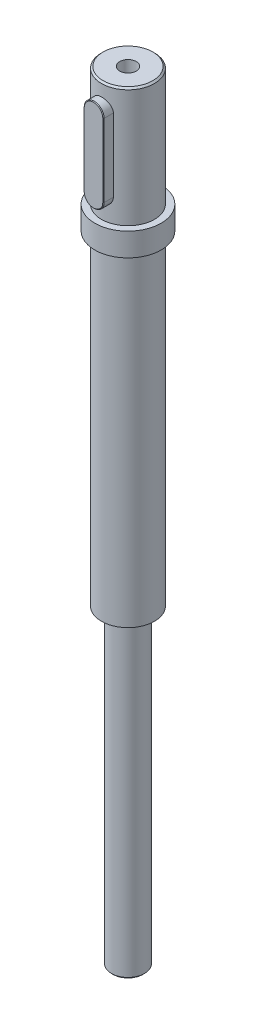
ISO-10303-21;
HEADER;
FILE_DESCRIPTION(('STEP AP214'),'2;1');
FILE_NAME('part.step','',(''),(''),'','','');
FILE_SCHEMA(('AUTOMOTIVE_DESIGN { 1 0 10303 214 1 1 1 1 }'));
ENDSEC;
DATA;
#1=APPLICATION_CONTEXT('core data for automotive mechanical design processes');
#2=APPLICATION_PROTOCOL_DEFINITION('international standard','automotive_design',2000,#1);
#3=PRODUCT_CONTEXT('',#1,'mechanical');
#4=PRODUCT('Part','Part','',(#3));
#5=PRODUCT_RELATED_PRODUCT_CATEGORY('part','',(#4));
#6=PRODUCT_DEFINITION_FORMATION('','',#4);
#7=PRODUCT_DEFINITION_CONTEXT('part definition',#1,'design');
#8=PRODUCT_DEFINITION('design','',#6,#7);
#9=PRODUCT_DEFINITION_SHAPE('','',#8);
#10=(LENGTH_UNIT() NAMED_UNIT(*) SI_UNIT(.MILLI.,.METRE.));
#11=(NAMED_UNIT(*) PLANE_ANGLE_UNIT() SI_UNIT($,.RADIAN.));
#12=(NAMED_UNIT(*) SI_UNIT($,.STERADIAN.) SOLID_ANGLE_UNIT());
#13=UNCERTAINTY_MEASURE_WITH_UNIT(LENGTH_MEASURE(1.E-05),#10,'distance_accuracy_value','');
#14=(GEOMETRIC_REPRESENTATION_CONTEXT(3) GLOBAL_UNCERTAINTY_ASSIGNED_CONTEXT((#13)) GLOBAL_UNIT_ASSIGNED_CONTEXT((#10,
#11,#12)) REPRESENTATION_CONTEXT('',''));
#15=CARTESIAN_POINT('',(0.,0.,0.));
#16=DIRECTION('',(0.,0.,1.));
#17=DIRECTION('',(1.,0.,0.));
#18=AXIS2_PLACEMENT_3D('',#15,#16,#17);
#19=CARTESIAN_POINT('',(0.,117.5,0.));
#20=DIRECTION('',(0.,-1.,0.));
#21=DIRECTION('',(0.,0.,-1.));
#22=AXIS2_PLACEMENT_3D('',#19,#20,#21);
#23=CYLINDRICAL_SURFACE('',#22,4.);
#24=CARTESIAN_POINT('',(0.,117.25,0.));
#25=DIRECTION('',(0.,1.,0.));
#26=DIRECTION('',(0.,0.,1.));
#27=AXIS2_PLACEMENT_3D('',#24,#25,#26);
#28=CIRCLE('',#27,4.);
#29=CARTESIAN_POINT('',(0.,117.25,4.));
#30=VERTEX_POINT('',#29);
#31=EDGE_CURVE('E161',#30,#30,#28,.F.);
#32=ORIENTED_EDGE('',*,*,#31,.T.);
#33=EDGE_LOOP('',(#32));
#34=FACE_BOUND('',#33,.T.);
#35=CARTESIAN_POINT('',(0.,99.5,0.));
#36=DIRECTION('',(0.,1.,0.));
#37=DIRECTION('',(0.,0.,1.));
#38=AXIS2_PLACEMENT_3D('',#35,#36,#37);
#39=CIRCLE('',#38,4.);
#40=CARTESIAN_POINT('',(0.,99.5,4.));
#41=VERTEX_POINT('',#40);
#42=EDGE_CURVE('E117',#41,#41,#39,.T.);
#43=ORIENTED_EDGE('',*,*,#42,.T.);
#44=EDGE_LOOP('',(#43));
#45=FACE_BOUND('',#44,.T.);
#46=CARTESIAN_POINT('',(-1.5,103.,3.70809924354783));
#47=CARTESIAN_POINT('',(-1.50000304106109,102.918992516279,3.70809640633806));
#48=CARTESIAN_POINT('',(-1.49341597549487,102.838005077496,3.71078260240986));
#49=CARTESIAN_POINT('',(-1.46736187895468,102.678471917087,3.72116159304967));
#50=CARTESIAN_POINT('',(-1.44789523373263,102.599926122405,3.72885423767112));
#51=CARTESIAN_POINT('',(-1.39689657610574,102.447624628386,3.748254802809));
#52=CARTESIAN_POINT('',(-1.36539347266348,102.373857943349,3.7599530956926));
#53=CARTESIAN_POINT('',(-1.29131856742698,102.232628103181,3.78603134206598));
#54=CARTESIAN_POINT('',(-1.24874344095039,102.165166849718,3.80041210067323));
#55=CARTESIAN_POINT('',(-1.15146661374163,102.035109688377,3.83103574665712));
#56=CARTESIAN_POINT('',(-1.09630381213307,101.972871470371,3.84733341923603));
#57=CARTESIAN_POINT('',(-0.976395839778934,101.858277185329,3.87949750628547));
#58=CARTESIAN_POINT('',(-0.911648630256685,101.805923226258,3.89536382814785));
#59=CARTESIAN_POINT('',(-0.771694655177602,101.710860487704,3.92552873936553));
#60=CARTESIAN_POINT('',(-0.696206947538028,101.668540525284,3.93975561223505));
#61=CARTESIAN_POINT('',(-0.538555771965246,101.597348827475,3.96438007973847));
#62=CARTESIAN_POINT('',(-0.456394630933535,101.568472428008,3.97477900217006));
#63=CARTESIAN_POINT('',(-0.291489341676831,101.526242104225,3.9901869710344));
#64=CARTESIAN_POINT('',(-0.208923197281596,101.51227237256,3.99540915214774));
#65=CARTESIAN_POINT('',(-0.0424643637947871,101.498278799055,4.0006401410794));
#66=CARTESIAN_POINT('',(0.041427885062831,101.498250422381,4.00065064414902));
#67=CARTESIAN_POINT('',(0.203743543064475,101.511781761465,3.99559265903894));
#68=CARTESIAN_POINT('',(0.2822321782669,101.524669297949,3.99077541996683));
#69=CARTESIAN_POINT('',(0.435839217984393,101.562535915226,3.97693274932263));
#70=CARTESIAN_POINT('',(0.510957383430299,101.587515852262,3.96790701975578));
#71=CARTESIAN_POINT('',(0.656989017303104,101.649170451676,3.94637769167531));
#72=CARTESIAN_POINT('',(0.727825392287309,101.686010005268,3.93382539470077));
#73=CARTESIAN_POINT('',(0.862486607957559,101.770192096929,3.90651310225279));
#74=CARTESIAN_POINT('',(0.926309176932322,101.817538023018,3.8917523951284));
#75=CARTESIAN_POINT('',(1.04909048680093,101.924627286283,3.86052529655816));
#76=CARTESIAN_POINT('',(1.10754614526348,101.98493391565,3.84400963763883));
#77=CARTESIAN_POINT('',(1.21370395569343,102.114592993322,3.81182460645722));
#78=CARTESIAN_POINT('',(1.261403406929,102.183947706587,3.79615544748847));
#79=CARTESIAN_POINT('',(1.34565611808151,102.331719467463,3.76712703500335));
#80=CARTESIAN_POINT('',(1.3819384785183,102.410303493686,3.75382677150277));
#81=CARTESIAN_POINT('',(1.44056464441501,102.573096225168,3.73172438629003));
#82=CARTESIAN_POINT('',(1.46291620605595,102.657301771594,3.72291976205783));
#83=CARTESIAN_POINT('',(1.49190191709668,102.823975962316,3.71139597222848));
#84=CARTESIAN_POINT('',(1.49933521158966,102.906284105536,3.70836785241537));
#85=CARTESIAN_POINT('',(1.50057885636272,103.071009356742,3.70786539525016));
#86=CARTESIAN_POINT('',(1.49439261093762,103.153426432352,3.71038967003987));
#87=CARTESIAN_POINT('',(1.46929733520157,103.311929922288,3.72039381629735));
#88=CARTESIAN_POINT('',(1.45100618334225,103.388131135765,3.72763276216449));
#89=CARTESIAN_POINT('',(1.40299774640638,103.53634794472,3.74596487046362));
#90=CARTESIAN_POINT('',(1.37327812034623,103.608362679168,3.75705882250173));
#91=CARTESIAN_POINT('',(1.30200292275278,103.749164438076,3.7823624311608));
#92=CARTESIAN_POINT('',(1.26004545177046,103.817729292137,3.79667328892065));
#93=CARTESIAN_POINT('',(1.16591317862479,103.947128981726,3.82662814294291));
#94=CARTESIAN_POINT('',(1.11373463696435,104.007960974625,3.84227262594077));
#95=CARTESIAN_POINT('',(0.996727340900941,104.124168373195,3.87433046553184));
#96=CARTESIAN_POINT('',(0.931306341491062,104.178953408769,3.89072969357028));
#97=CARTESIAN_POINT('',(0.791797471753148,104.276838367589,3.92149874963302));
#98=CARTESIAN_POINT('',(0.717709573322671,104.319938252946,3.93586857107664));
#99=CARTESIAN_POINT('',(0.563016329468475,104.3929460562,3.96094985704552));
#100=CARTESIAN_POINT('',(0.482434433064626,104.422899123793,3.9716738133801));
#101=CARTESIAN_POINT('',(0.316881887523253,104.46865641385,3.98829436712571));
#102=CARTESIAN_POINT('',(0.23191332072359,104.484467285422,3.99419323299413));
#103=CARTESIAN_POINT('',(0.0653355852738132,104.500774402755,4.00028407317073));
#104=CARTESIAN_POINT('',(-0.0161807680608467,104.502109483059,4.00078860953764));
#105=CARTESIAN_POINT('',(-0.178226786412424,104.491584840555,3.99684889809223));
#106=CARTESIAN_POINT('',(-0.258756569245257,104.479726709114,3.9924052471313));
#107=CARTESIAN_POINT('',(-0.414548248377124,104.443741148506,3.97921089603771));
#108=CARTESIAN_POINT('',(-0.489890731068831,104.419920094122,3.97056791378017));
#109=CARTESIAN_POINT('',(-0.635515473006387,104.360989986616,3.9498778362099));
#110=CARTESIAN_POINT('',(-0.705796771275542,104.325878796695,3.93783009655664));
#111=CARTESIAN_POINT('',(-0.842540176994411,104.243686056495,3.91090618300074));
#112=CARTESIAN_POINT('',(-0.908717548846845,104.196163359486,3.89593240108829));
#113=CARTESIAN_POINT('',(-1.03241734752336,104.091192169812,3.86499507694844));
#114=CARTESIAN_POINT('',(-1.0899366712559,104.033740134192,3.84903118274027));
#115=CARTESIAN_POINT('',(-1.19781214236196,103.906935868355,3.81688129739175));
#116=CARTESIAN_POINT('',(-1.24762999816025,103.837115597846,3.8007280534916));
#117=CARTESIAN_POINT('',(-1.33484709556843,103.689584130427,3.77098325003638));
#118=CARTESIAN_POINT('',(-1.37224504878156,103.611872115947,3.75739195631217));
#119=CARTESIAN_POINT('',(-1.4346588697426,103.447044319025,3.73402269853266));
#120=CARTESIAN_POINT('',(-1.45906002899523,103.359665633488,3.7244380329086));
#121=CARTESIAN_POINT('',(-1.49172356722079,103.181514728044,3.71147994336315));
#122=CARTESIAN_POINT('',(-1.49999659339571,103.09074478729,3.70810242179736));
#123=CARTESIAN_POINT('',(-1.5,103.,3.70809924354783));
#124=B_SPLINE_CURVE_WITH_KNOTS('',3,(#46,#47,#48,#49,#50,#51,#52,#53,#54,#55,#56,#57,#58,#59,
#60,#61,#62,#63,#64,#65,#66,#67,#68,#69,#70,#71,#72,#73,#74,#75,#76,#77,#78,#79,#80,#81,#82,#83,
#84,#85,#86,#87,#88,#89,#90,#91,#92,#93,#94,#95,#96,#97,#98,#99,#100,#101,#102,#103,#104,#105,
#106,#107,#108,#109,#110,#111,#112,#113,#114,#115,#116,#117,#118,#119,#120,#121,#122,#123),
.UNSPECIFIED.,.T.,.F.,(4,2,2,2,2,2,2,2,2,2,2,2,2,2,2,2,2,2,2,2,2,2,2,2,2,2,2,2,2,2,2,2,2,2,2,2,
2,2,4),(0.,0.242684541416171,0.485361814598854,0.727459856757025,0.969630679682926,
1.22274652401127,1.47591628822983,1.73770072136422,1.99939426381331,2.24980018489679,
2.50012465404857,2.73806472803195,2.97602165263335,3.21744131210668,3.45893893628976,
3.71456675065874,3.97025867827334,4.23162592252965,4.49284751635474,4.73965657740485,
4.98640395388884,5.22143845928199,5.45652113429525,5.70041561005822,5.94439948466355,
6.20385016993624,6.46330169650178,6.72185508890169,6.98028685560127,7.22365720549936,
7.4669982031948,7.7044027400389,7.94185223512831,8.18928323676987,8.43680270894965,
8.69738599542079,8.95799630544242,9.23003178870927,9.50188762323053),.UNSPECIFIED.);
#125=CARTESIAN_POINT('',(-1.5,103.,3.70809924354783));
#126=VERTEX_POINT('',#125);
#127=CARTESIAN_POINT('',(1.5,103.,3.70809924354783));
#128=VERTEX_POINT('',#127);
#129=EDGE_CURVE('E98',#126,#128,#124,.T.);
#130=ORIENTED_EDGE('',*,*,#129,.F.);
#131=DIRECTION('',(0.,-1.,0.));
#132=VECTOR('',#131,1.);
#133=CARTESIAN_POINT('',(-1.5,117.5,3.70809924354783));
#134=LINE('',#133,#132);
#135=CARTESIAN_POINT('',(-1.5,114.,3.70809924354783));
#136=VERTEX_POINT('',#135);
#137=EDGE_CURVE('E108',#136,#126,#134,.T.);
#138=ORIENTED_EDGE('',*,*,#137,.F.);
#139=CARTESIAN_POINT('',(-1.5,114.,3.70809924354783));
#140=CARTESIAN_POINT('',(-1.50000304106109,113.918992516279,3.70809640633806));
#141=CARTESIAN_POINT('',(-1.49341597549487,113.838005077496,3.71078260240986));
#142=CARTESIAN_POINT('',(-1.46736187895468,113.678471917087,3.72116159304967));
#143=CARTESIAN_POINT('',(-1.44789523373263,113.599926122405,3.72885423767112));
#144=CARTESIAN_POINT('',(-1.39689657610574,113.447624628386,3.748254802809));
#145=CARTESIAN_POINT('',(-1.36539347266348,113.373857943349,3.7599530956926));
#146=CARTESIAN_POINT('',(-1.29131856742698,113.232628103181,3.78603134206598));
#147=CARTESIAN_POINT('',(-1.24874344095039,113.165166849718,3.80041210067323));
#148=CARTESIAN_POINT('',(-1.15146661374163,113.035109688377,3.83103574665712));
#149=CARTESIAN_POINT('',(-1.09630381213307,112.972871470371,3.84733341923603));
#150=CARTESIAN_POINT('',(-0.97639583977893,112.858277185329,3.87949750628547));
#151=CARTESIAN_POINT('',(-0.911648630256684,112.805923226258,3.89536382814785));
#152=CARTESIAN_POINT('',(-0.771694655177605,112.710860487704,3.92552873936553));
#153=CARTESIAN_POINT('',(-0.696206947538032,112.668540525284,3.93975561223505));
#154=CARTESIAN_POINT('',(-0.538555771965248,112.597348827475,3.96438007973848));
#155=CARTESIAN_POINT('',(-0.456394630933533,112.568472428008,3.97477900217006));
#156=CARTESIAN_POINT('',(-0.291489341676828,112.526242104225,3.9901869710344));
#157=CARTESIAN_POINT('',(-0.208923197281593,112.51227237256,3.99540915214774));
#158=CARTESIAN_POINT('',(-0.042464363794786,112.498278799055,4.0006401410794));
#159=CARTESIAN_POINT('',(0.0414278850628317,112.498250422381,4.00065064414902));
#160=CARTESIAN_POINT('',(0.203743543064474,112.511781761465,3.99559265903894));
#161=CARTESIAN_POINT('',(0.282232178266899,112.524669297949,3.99077541996683));
#162=CARTESIAN_POINT('',(0.435839217984391,112.562535915226,3.97693274932263));
#163=CARTESIAN_POINT('',(0.510957383430298,112.587515852262,3.96790701975578));
#164=CARTESIAN_POINT('',(0.656989017303105,112.649170451676,3.94637769167531));
#165=CARTESIAN_POINT('',(0.72782539228731,112.686010005268,3.93382539470077));
#166=CARTESIAN_POINT('',(0.86248660795756,112.770192096929,3.90651310225279));
#167=CARTESIAN_POINT('',(0.926309176932322,112.817538023018,3.8917523951284));
#168=CARTESIAN_POINT('',(1.04909048680094,112.924627286283,3.86052529655816));
#169=CARTESIAN_POINT('',(1.10754614526348,112.98493391565,3.84400963763883));
#170=CARTESIAN_POINT('',(1.21370395569343,113.114592993322,3.81182460645722));
#171=CARTESIAN_POINT('',(1.261403406929,113.183947706587,3.79615544748847));
#172=CARTESIAN_POINT('',(1.34565611808151,113.331719467463,3.76712703500335));
#173=CARTESIAN_POINT('',(1.38193847851831,113.410303493686,3.75382677150277));
#174=CARTESIAN_POINT('',(1.44056464441501,113.573096225168,3.73172438629002));
#175=CARTESIAN_POINT('',(1.46291620605595,113.657301771594,3.72291976205783));
#176=CARTESIAN_POINT('',(1.49190191709668,113.823975962316,3.71139597222848));
#177=CARTESIAN_POINT('',(1.49933521158966,113.906284105536,3.70836785241537));
#178=CARTESIAN_POINT('',(1.50057885636272,114.071009356742,3.70786539525016));
#179=CARTESIAN_POINT('',(1.49439261093762,114.153426432352,3.71038967003987));
#180=CARTESIAN_POINT('',(1.46929733520157,114.311929922288,3.72039381629735));
#181=CARTESIAN_POINT('',(1.45100618334225,114.388131135765,3.72763276216449));
#182=CARTESIAN_POINT('',(1.40299774640638,114.53634794472,3.74596487046361));
#183=CARTESIAN_POINT('',(1.37327812034623,114.608362679168,3.75705882250173));
#184=CARTESIAN_POINT('',(1.30200292275278,114.749164438076,3.7823624311608));
#185=CARTESIAN_POINT('',(1.26004545177047,114.817729292137,3.79667328892065));
#186=CARTESIAN_POINT('',(1.1659131786248,114.947128981726,3.82662814294291));
#187=CARTESIAN_POINT('',(1.11373463696435,115.007960974625,3.84227262594077));
#188=CARTESIAN_POINT('',(0.996727340900941,115.124168373195,3.87433046553184));
#189=CARTESIAN_POINT('',(0.931306341491062,115.178953408769,3.89072969357027));
#190=CARTESIAN_POINT('',(0.79179747175315,115.276838367589,3.92149874963302));
#191=CARTESIAN_POINT('',(0.717709573322673,115.319938252946,3.93586857107664));
#192=CARTESIAN_POINT('',(0.563016329468476,115.3929460562,3.96094985704552));
#193=CARTESIAN_POINT('',(0.482434433064624,115.422899123793,3.9716738133801));
#194=CARTESIAN_POINT('',(0.316881887523252,115.46865641385,3.98829436712571));
#195=CARTESIAN_POINT('',(0.231913320723591,115.484467285422,3.99419323299412));
#196=CARTESIAN_POINT('',(0.0653355852738152,115.500774402755,4.00028407317073));
#197=CARTESIAN_POINT('',(-0.0161807680608452,115.502109483059,4.00078860953764));
#198=CARTESIAN_POINT('',(-0.178226786412423,115.491584840555,3.99684889809223));
#199=CARTESIAN_POINT('',(-0.258756569245257,115.479726709114,3.9924052471313));
#200=CARTESIAN_POINT('',(-0.414548248377126,115.443741148506,3.97921089603771));
#201=CARTESIAN_POINT('',(-0.489890731068834,115.419920094122,3.97056791378017));
#202=CARTESIAN_POINT('',(-0.635515473006389,115.360989986616,3.9498778362099));
#203=CARTESIAN_POINT('',(-0.705796771275541,115.325878796695,3.93783009655664));
#204=CARTESIAN_POINT('',(-0.842540176994412,115.243686056495,3.91090618300074));
#205=CARTESIAN_POINT('',(-0.908717548846851,115.196163359486,3.89593240108828));
#206=CARTESIAN_POINT('',(-1.03241734752336,115.091192169812,3.86499507694844));
#207=CARTESIAN_POINT('',(-1.0899366712559,115.033740134192,3.84903118274027));
#208=CARTESIAN_POINT('',(-1.19781214236195,114.906935868355,3.81688129739175));
#209=CARTESIAN_POINT('',(-1.24762999816025,114.837115597846,3.8007280534916));
#210=CARTESIAN_POINT('',(-1.33484709556843,114.689584130427,3.77098325003638));
#211=CARTESIAN_POINT('',(-1.37224504878156,114.611872115947,3.75739195631217));
#212=CARTESIAN_POINT('',(-1.4346588697426,114.447044319025,3.73402269853266));
#213=CARTESIAN_POINT('',(-1.45906002899522,114.359665633488,3.7244380329086));
#214=CARTESIAN_POINT('',(-1.49172356722079,114.181514728044,3.71147994336315));
#215=CARTESIAN_POINT('',(-1.49999659339571,114.09074478729,3.70810242179736));
#216=CARTESIAN_POINT('',(-1.5,114.,3.70809924354783));
#217=B_SPLINE_CURVE_WITH_KNOTS('',3,(#139,#140,#141,#142,#143,#144,#145,#146,#147,#148,#149,
#150,#151,#152,#153,#154,#155,#156,#157,#158,#159,#160,#161,#162,#163,#164,#165,#166,#167,#168,
#169,#170,#171,#172,#173,#174,#175,#176,#177,#178,#179,#180,#181,#182,#183,#184,#185,#186,#187,
#188,#189,#190,#191,#192,#193,#194,#195,#196,#197,#198,#199,#200,#201,#202,#203,#204,#205,#206,
#207,#208,#209,#210,#211,#212,#213,#214,#215,#216),.UNSPECIFIED.,.T.,.F.,(4,2,2,2,2,2,2,2,2,2,2,
2,2,2,2,2,2,2,2,2,2,2,2,2,2,2,2,2,2,2,2,2,2,2,2,2,2,2,4),(0.,0.242684541416171,
0.485361814598854,0.727459856757025,0.969630679682926,1.22274652401127,1.47591628822982,
1.73770072136421,1.99939426381331,2.24980018489679,2.50012465404857,2.73806472803194,
2.97602165263335,3.21744131210668,3.45893893628976,3.71456675065875,3.97025867827335,
4.23162592252966,4.49284751635474,4.73965657740485,4.98640395388885,5.22143845928198,
5.45652113429526,5.70041561005822,5.94439948466355,6.20385016993625,6.46330169650178,
6.72185508890169,6.98028685560128,7.22365720549937,7.4669982031948,7.70440274003891,
7.94185223512831,8.18928323676988,8.43680270894966,8.69738599542078,8.95799630544242,
9.23003178870925,9.50188762323054),.UNSPECIFIED.);
#218=CARTESIAN_POINT('',(1.5,114.,3.70809924354783));
#219=VERTEX_POINT('',#218);
#220=EDGE_CURVE('E116',#219,#136,#217,.T.);
#221=ORIENTED_EDGE('',*,*,#220,.F.);
#222=DIRECTION('',(0.,-1.,0.));
#223=VECTOR('',#222,1.);
#224=CARTESIAN_POINT('',(1.5,117.5,3.70809924354783));
#225=LINE('',#224,#223);
#226=EDGE_CURVE('E111',#128,#219,#225,.F.);
#227=ORIENTED_EDGE('',*,*,#226,.F.);
#228=EDGE_LOOP('',(#130,#138,#221,#227));
#229=FACE_BOUND('',#228,.T.);
#230=ADVANCED_FACE('F40',(#34,#45,#229),#23,.T.);
#231=CARTESIAN_POINT('',(0.,47.,0.));
#232=DIRECTION('',(0.,-1.,0.));
#233=DIRECTION('',(0.,0.,-1.));
#234=AXIS2_PLACEMENT_3D('',#231,#232,#233);
#235=CYLINDRICAL_SURFACE('',#234,2.5);
#236=CARTESIAN_POINT('',(0.,0.250000000000014,0.));
#237=DIRECTION('',(0.,1.,0.));
#238=DIRECTION('',(0.,0.,1.));
#239=AXIS2_PLACEMENT_3D('',#236,#237,#238);
#240=CIRCLE('',#239,2.5);
#241=CARTESIAN_POINT('',(0.,0.250000000000014,2.5));
#242=VERTEX_POINT('',#241);
#243=EDGE_CURVE('E112',#242,#242,#240,.T.);
#244=ORIENTED_EDGE('',*,*,#243,.T.);
#245=EDGE_LOOP('',(#244));
#246=FACE_BOUND('',#245,.T.);
#247=CARTESIAN_POINT('',(0.,47.,0.));
#248=DIRECTION('',(0.,1.,0.));
#249=DIRECTION('',(0.,0.,1.));
#250=AXIS2_PLACEMENT_3D('',#247,#248,#249);
#251=CIRCLE('',#250,2.5);
#252=CARTESIAN_POINT('',(0.,47.,2.5));
#253=VERTEX_POINT('',#252);
#254=EDGE_CURVE('E121',#253,#253,#251,.T.);
#255=ORIENTED_EDGE('',*,*,#254,.F.);
#256=EDGE_LOOP('',(#255));
#257=FACE_BOUND('',#256,.T.);
#258=ADVANCED_FACE('F215',(#246,#257),#235,.T.);
#259=CARTESIAN_POINT('',(0.,0.,0.));
#260=DIRECTION('',(0.,1.,0.));
#261=DIRECTION('',(0.,0.,1.));
#262=AXIS2_PLACEMENT_3D('',#259,#260,#261);
#263=PLANE('',#262);
#264=CARTESIAN_POINT('',(0.,0.,0.));
#265=DIRECTION('',(0.,1.,0.));
#266=DIRECTION('',(0.,0.,1.));
#267=AXIS2_PLACEMENT_3D('',#264,#265,#266);
#268=CIRCLE('',#267,2.24999999999999);
#269=CARTESIAN_POINT('',(0.,0.,2.24999999999999));
#270=VERTEX_POINT('',#269);
#271=EDGE_CURVE('E155',#270,#270,#268,.F.);
#272=ORIENTED_EDGE('',*,*,#271,.T.);
#273=EDGE_LOOP('',(#272));
#274=FACE_BOUND('',#273,.T.);
#275=ADVANCED_FACE('F220',(#274),#263,.F.);
#276=CARTESIAN_POINT('',(0.,96.,0.));
#277=DIRECTION('',(0.,-1.,0.));
#278=DIRECTION('',(0.,0.,-1.));
#279=AXIS2_PLACEMENT_3D('',#276,#277,#278);
#280=CYLINDRICAL_SURFACE('',#279,4.);
#281=CARTESIAN_POINT('',(0.,96.,0.));
#282=DIRECTION('',(0.,1.,0.));
#283=DIRECTION('',(0.,0.,1.));
#284=AXIS2_PLACEMENT_3D('',#281,#282,#283);
#285=CIRCLE('',#284,4.);
#286=CARTESIAN_POINT('',(0.,96.,4.));
#287=VERTEX_POINT('',#286);
#288=EDGE_CURVE('E240',#287,#287,#285,.T.);
#289=ORIENTED_EDGE('',*,*,#288,.F.);
#290=EDGE_LOOP('',(#289));
#291=FACE_BOUND('',#290,.T.);
#292=CARTESIAN_POINT('',(0.,47.,0.));
#293=DIRECTION('',(0.,1.,0.));
#294=DIRECTION('',(0.,0.,1.));
#295=AXIS2_PLACEMENT_3D('',#292,#293,#294);
#296=CIRCLE('',#295,4.);
#297=CARTESIAN_POINT('',(0.,47.,4.));
#298=VERTEX_POINT('',#297);
#299=EDGE_CURVE('E236',#298,#298,#296,.T.);
#300=ORIENTED_EDGE('',*,*,#299,.T.);
#301=EDGE_LOOP('',(#300));
#302=FACE_BOUND('',#301,.T.);
#303=ADVANCED_FACE('F256',(#291,#302),#280,.T.);
#304=CARTESIAN_POINT('',(0.,47.,0.));
#305=DIRECTION('',(0.,1.,0.));
#306=DIRECTION('',(0.,0.,1.));
#307=AXIS2_PLACEMENT_3D('',#304,#305,#306);
#308=PLANE('',#307);
#309=ORIENTED_EDGE('',*,*,#254,.T.);
#310=EDGE_LOOP('',(#309));
#311=FACE_BOUND('',#310,.T.);
#312=ORIENTED_EDGE('',*,*,#299,.F.);
#313=EDGE_LOOP('',(#312));
#314=FACE_BOUND('',#313,.T.);
#315=ADVANCED_FACE('F252',(#311,#314),#308,.F.);
#316=CARTESIAN_POINT('',(0.,99.5,0.));
#317=DIRECTION('',(0.,-1.,0.));
#318=DIRECTION('',(0.,0.,-1.));
#319=AXIS2_PLACEMENT_3D('',#316,#317,#318);
#320=CYLINDRICAL_SURFACE('',#319,5.);
#321=CARTESIAN_POINT('',(0.,99.5,0.));
#322=DIRECTION('',(0.,1.,0.));
#323=DIRECTION('',(0.,0.,1.));
#324=AXIS2_PLACEMENT_3D('',#321,#322,#323);
#325=CIRCLE('',#324,5.);
#326=CARTESIAN_POINT('',(0.,99.5,5.));
#327=VERTEX_POINT('',#326);
#328=EDGE_CURVE('E234',#327,#327,#325,.T.);
#329=ORIENTED_EDGE('',*,*,#328,.F.);
#330=EDGE_LOOP('',(#329));
#331=FACE_BOUND('',#330,.T.);
#332=CARTESIAN_POINT('',(0.,96.,0.));
#333=DIRECTION('',(0.,1.,0.));
#334=DIRECTION('',(0.,0.,1.));
#335=AXIS2_PLACEMENT_3D('',#332,#333,#334);
#336=CIRCLE('',#335,5.);
#337=CARTESIAN_POINT('',(0.,96.,5.));
#338=VERTEX_POINT('',#337);
#339=EDGE_CURVE('E237',#338,#338,#336,.T.);
#340=ORIENTED_EDGE('',*,*,#339,.T.);
#341=EDGE_LOOP('',(#340));
#342=FACE_BOUND('',#341,.T.);
#343=ADVANCED_FACE('F231',(#331,#342),#320,.T.);
#344=CARTESIAN_POINT('',(0.,99.5,0.));
#345=DIRECTION('',(0.,1.,0.));
#346=DIRECTION('',(0.,0.,1.));
#347=AXIS2_PLACEMENT_3D('',#344,#345,#346);
#348=PLANE('',#347);
#349=ORIENTED_EDGE('',*,*,#42,.F.);
#350=EDGE_LOOP('',(#349));
#351=FACE_BOUND('',#350,.T.);
#352=ORIENTED_EDGE('',*,*,#328,.T.);
#353=EDGE_LOOP('',(#352));
#354=FACE_BOUND('',#353,.T.);
#355=ADVANCED_FACE('F227',(#351,#354),#348,.T.);
#356=CARTESIAN_POINT('',(0.,96.,0.));
#357=DIRECTION('',(0.,1.,0.));
#358=DIRECTION('',(0.,0.,1.));
#359=AXIS2_PLACEMENT_3D('',#356,#357,#358);
#360=PLANE('',#359);
#361=ORIENTED_EDGE('',*,*,#288,.T.);
#362=EDGE_LOOP('',(#361));
#363=FACE_BOUND('',#362,.T.);
#364=ORIENTED_EDGE('',*,*,#339,.F.);
#365=EDGE_LOOP('',(#364));
#366=FACE_BOUND('',#365,.T.);
#367=ADVANCED_FACE('F230',(#363,#366),#360,.F.);
#368=CARTESIAN_POINT('',(0.,117.5,0.));
#369=DIRECTION('',(0.,1.,0.));
#370=DIRECTION('',(0.,0.,1.));
#371=AXIS2_PLACEMENT_3D('',#368,#369,#370);
#372=PLANE('',#371);
#373=CARTESIAN_POINT('',(0.,117.5,0.));
#374=DIRECTION('',(0.,1.,0.));
#375=DIRECTION('',(0.,0.,1.));
#376=AXIS2_PLACEMENT_3D('',#373,#374,#375);
#377=CIRCLE('',#376,3.75);
#378=CARTESIAN_POINT('',(0.,117.5,3.75));
#379=VERTEX_POINT('',#378);
#380=EDGE_CURVE('E158',#379,#379,#377,.T.);
#381=ORIENTED_EDGE('',*,*,#380,.T.);
#382=EDGE_LOOP('',(#381));
#383=FACE_BOUND('',#382,.T.);
#384=CARTESIAN_POINT('',(0.,117.5,0.));
#385=DIRECTION('',(0.,1.,0.));
#386=DIRECTION('',(0.,0.,1.));
#387=AXIS2_PLACEMENT_3D('',#384,#385,#386);
#388=CIRCLE('',#387,1.24999999999999);
#389=CARTESIAN_POINT('',(0.,117.5,1.24999999999999));
#390=VERTEX_POINT('',#389);
#391=EDGE_CURVE('E419',#390,#390,#388,.T.);
#392=ORIENTED_EDGE('',*,*,#391,.F.);
#393=EDGE_LOOP('',(#392));
#394=FACE_BOUND('',#393,.T.);
#395=ADVANCED_FACE('F312',(#383,#394),#372,.T.);
#396=CARTESIAN_POINT('',(0.,107.5,0.));
#397=DIRECTION('',(0.,1.,0.));
#398=DIRECTION('',(0.,0.,1.));
#399=AXIS2_PLACEMENT_3D('',#396,#397,#398);
#400=CONICAL_SURFACE('',#399,1.25,1.02974425867665);
#401=CARTESIAN_POINT('',(0.,106.748924226216,0.));
#402=VERTEX_POINT('',#401);
#403=VERTEX_LOOP('',#402);
#404=FACE_BOUND('',#403,.T.);
#405=CARTESIAN_POINT('',(0.,107.5,0.));
#406=DIRECTION('',(0.,1.,0.));
#407=DIRECTION('',(0.,0.,1.));
#408=AXIS2_PLACEMENT_3D('',#405,#406,#407);
#409=CIRCLE('',#408,1.25);
#410=CARTESIAN_POINT('',(0.,107.5,1.25));
#411=VERTEX_POINT('',#410);
#412=EDGE_CURVE('E242',#411,#411,#409,.T.);
#413=ORIENTED_EDGE('',*,*,#412,.T.);
#414=EDGE_LOOP('',(#413));
#415=FACE_BOUND('',#414,.T.);
#416=ADVANCED_FACE('F317',(#404,#415),#400,.F.);
#417=CARTESIAN_POINT('',(0.,117.5,0.));
#418=DIRECTION('',(0.,1.,0.));
#419=DIRECTION('',(0.,0.,1.));
#420=AXIS2_PLACEMENT_3D('',#417,#418,#419);
#421=CYLINDRICAL_SURFACE('',#420,1.24999999999999);
#422=ORIENTED_EDGE('',*,*,#412,.F.);
#423=EDGE_LOOP('',(#422));
#424=FACE_BOUND('',#423,.T.);
#425=ORIENTED_EDGE('',*,*,#391,.T.);
#426=EDGE_LOOP('',(#425));
#427=FACE_BOUND('',#426,.T.);
#428=ADVANCED_FACE('F147',(#424,#427),#421,.F.);
#429=CARTESIAN_POINT('',(0.,103.,5.2));
#430=DIRECTION('',(0.,0.,-1.));
#431=DIRECTION('',(-1.,0.,0.));
#432=AXIS2_PLACEMENT_3D('',#429,#430,#431);
#433=CYLINDRICAL_SURFACE('',#432,1.5);
#434=DIRECTION('',(0.,0.,-1.));
#435=VECTOR('',#434,1.);
#436=CARTESIAN_POINT('',(1.5,103.,5.2));
#437=LINE('',#436,#435);
#438=CARTESIAN_POINT('',(1.5,103.,5.1));
#439=VERTEX_POINT('',#438);
#440=EDGE_CURVE('E421',#439,#128,#437,.T.);
#441=ORIENTED_EDGE('',*,*,#440,.F.);
#442=CARTESIAN_POINT('',(0.,103.,5.1));
#443=DIRECTION('',(0.,0.,1.));
#444=DIRECTION('',(1.,0.,0.));
#445=AXIS2_PLACEMENT_3D('',#442,#443,#444);
#446=CIRCLE('',#445,1.5);
#447=CARTESIAN_POINT('',(-1.5,103.,5.1));
#448=VERTEX_POINT('',#447);
#449=EDGE_CURVE('E50',#439,#448,#446,.F.);
#450=ORIENTED_EDGE('',*,*,#449,.T.);
#451=DIRECTION('',(0.,0.,-1.));
#452=VECTOR('',#451,1.);
#453=CARTESIAN_POINT('',(-1.5,103.,5.2));
#454=LINE('',#453,#452);
#455=EDGE_CURVE('E95',#448,#126,#454,.T.);
#456=ORIENTED_EDGE('',*,*,#455,.T.);
#457=ORIENTED_EDGE('',*,*,#129,.T.);
#458=EDGE_LOOP('',(#441,#450,#456,#457));
#459=FACE_BOUND('',#458,.T.);
#460=ADVANCED_FACE('F97',(#459),#433,.T.);
#461=CARTESIAN_POINT('',(1.5,103.,5.2));
#462=DIRECTION('',(-1.,0.,0.));
#463=DIRECTION('',(0.,-1.,0.));
#464=AXIS2_PLACEMENT_3D('',#461,#462,#463);
#465=PLANE('',#464);
#466=DIRECTION('',(0.,0.,-1.));
#467=VECTOR('',#466,1.);
#468=CARTESIAN_POINT('',(1.5,114.,5.2));
#469=LINE('',#468,#467);
#470=CARTESIAN_POINT('',(1.5,114.,5.1));
#471=VERTEX_POINT('',#470);
#472=EDGE_CURVE('E198',#471,#219,#469,.T.);
#473=ORIENTED_EDGE('',*,*,#472,.F.);
#474=DIRECTION('',(0.,-1.,0.));
#475=VECTOR('',#474,1.);
#476=CARTESIAN_POINT('',(1.5,103.,5.1));
#477=LINE('',#476,#475);
#478=EDGE_CURVE('E11',#471,#439,#477,.T.);
#479=ORIENTED_EDGE('',*,*,#478,.T.);
#480=ORIENTED_EDGE('',*,*,#440,.T.);
#481=ORIENTED_EDGE('',*,*,#226,.T.);
#482=EDGE_LOOP('',(#473,#479,#480,#481));
#483=FACE_BOUND('',#482,.T.);
#484=ADVANCED_FACE('F139',(#483),#465,.F.);
#485=CARTESIAN_POINT('',(0.,114.,5.2));
#486=DIRECTION('',(0.,0.,-1.));
#487=DIRECTION('',(-1.,0.,0.));
#488=AXIS2_PLACEMENT_3D('',#485,#486,#487);
#489=CYLINDRICAL_SURFACE('',#488,1.5);
#490=DIRECTION('',(0.,0.,-1.));
#491=VECTOR('',#490,1.);
#492=CARTESIAN_POINT('',(-1.5,114.,5.2));
#493=LINE('',#492,#491);
#494=CARTESIAN_POINT('',(-1.5,114.,5.1));
#495=VERTEX_POINT('',#494);
#496=EDGE_CURVE('E102',#495,#136,#493,.T.);
#497=ORIENTED_EDGE('',*,*,#496,.F.);
#498=CARTESIAN_POINT('',(0.,114.,5.1));
#499=DIRECTION('',(0.,0.,1.));
#500=DIRECTION('',(1.,0.,0.));
#501=AXIS2_PLACEMENT_3D('',#498,#499,#500);
#502=CIRCLE('',#501,1.5);
#503=EDGE_CURVE('E173',#495,#471,#502,.F.);
#504=ORIENTED_EDGE('',*,*,#503,.T.);
#505=ORIENTED_EDGE('',*,*,#472,.T.);
#506=ORIENTED_EDGE('',*,*,#220,.T.);
#507=EDGE_LOOP('',(#497,#504,#505,#506));
#508=FACE_BOUND('',#507,.T.);
#509=ADVANCED_FACE('F134',(#508),#489,.T.);
#510=CARTESIAN_POINT('',(-1.5,103.,5.2));
#511=DIRECTION('',(1.,0.,0.));
#512=DIRECTION('',(0.,1.,0.));
#513=AXIS2_PLACEMENT_3D('',#510,#511,#512);
#514=PLANE('',#513);
#515=ORIENTED_EDGE('',*,*,#455,.F.);
#516=DIRECTION('',(0.,1.,0.));
#517=VECTOR('',#516,1.);
#518=CARTESIAN_POINT('',(-1.5,114.,5.1));
#519=LINE('',#518,#517);
#520=EDGE_CURVE('E176',#448,#495,#519,.T.);
#521=ORIENTED_EDGE('',*,*,#520,.T.);
#522=ORIENTED_EDGE('',*,*,#496,.T.);
#523=ORIENTED_EDGE('',*,*,#137,.T.);
#524=EDGE_LOOP('',(#515,#521,#522,#523));
#525=FACE_BOUND('',#524,.T.);
#526=ADVANCED_FACE('F114',(#525),#514,.F.);
#527=CARTESIAN_POINT('',(0.,103.,5.2));
#528=DIRECTION('',(0.,0.,1.));
#529=DIRECTION('',(1.,0.,0.));
#530=AXIS2_PLACEMENT_3D('',#527,#528,#529);
#531=PLANE('',#530);
#532=DIRECTION('',(0.,1.,0.));
#533=VECTOR('',#532,1.);
#534=CARTESIAN_POINT('',(1.4,114.,5.2));
#535=LINE('',#534,#533);
#536=CARTESIAN_POINT('',(1.4,103.,5.2));
#537=VERTEX_POINT('',#536);
#538=CARTESIAN_POINT('',(1.4,114.,5.2));
#539=VERTEX_POINT('',#538);
#540=EDGE_CURVE('E164',#537,#539,#535,.T.);
#541=ORIENTED_EDGE('',*,*,#540,.T.);
#542=CARTESIAN_POINT('',(0.,114.,5.2));
#543=DIRECTION('',(0.,0.,1.));
#544=DIRECTION('',(1.,0.,0.));
#545=AXIS2_PLACEMENT_3D('',#542,#543,#544);
#546=CIRCLE('',#545,1.4);
#547=CARTESIAN_POINT('',(-1.4,114.,5.2));
#548=VERTEX_POINT('',#547);
#549=EDGE_CURVE('E170',#539,#548,#546,.T.);
#550=ORIENTED_EDGE('',*,*,#549,.T.);
#551=DIRECTION('',(0.,-1.,0.));
#552=VECTOR('',#551,1.);
#553=CARTESIAN_POINT('',(-1.4,103.,5.2));
#554=LINE('',#553,#552);
#555=CARTESIAN_POINT('',(-1.4,103.,5.2));
#556=VERTEX_POINT('',#555);
#557=EDGE_CURVE('E168',#548,#556,#554,.T.);
#558=ORIENTED_EDGE('',*,*,#557,.T.);
#559=CARTESIAN_POINT('',(0.,103.,5.2));
#560=DIRECTION('',(0.,0.,1.));
#561=DIRECTION('',(1.,0.,0.));
#562=AXIS2_PLACEMENT_3D('',#559,#560,#561);
#563=CIRCLE('',#562,1.4);
#564=EDGE_CURVE('E166',#556,#537,#563,.T.);
#565=ORIENTED_EDGE('',*,*,#564,.T.);
#566=EDGE_LOOP('',(#541,#550,#558,#565));
#567=FACE_BOUND('',#566,.T.);
#568=ADVANCED_FACE('F204',(#567),#531,.T.);
#569=CARTESIAN_POINT('',(0.,0.250000000000014,0.));
#570=DIRECTION('',(0.,1.,0.));
#571=DIRECTION('',(0.,0.,1.));
#572=AXIS2_PLACEMENT_3D('',#569,#570,#571);
#573=CONICAL_SURFACE('',#572,2.5,0.785398163397443);
#574=ORIENTED_EDGE('',*,*,#271,.F.);
#575=EDGE_LOOP('',(#574));
#576=FACE_BOUND('',#575,.T.);
#577=ORIENTED_EDGE('',*,*,#243,.F.);
#578=EDGE_LOOP('',(#577));
#579=FACE_BOUND('',#578,.T.);
#580=ADVANCED_FACE('F206',(#576,#579),#573,.T.);
#581=CARTESIAN_POINT('',(0.,117.5,0.));
#582=DIRECTION('',(0.,-1.,0.));
#583=DIRECTION('',(0.,0.,-1.));
#584=AXIS2_PLACEMENT_3D('',#581,#582,#583);
#585=CONICAL_SURFACE('',#584,3.75,0.785398163397441);
#586=ORIENTED_EDGE('',*,*,#31,.F.);
#587=EDGE_LOOP('',(#586));
#588=FACE_BOUND('',#587,.T.);
#589=ORIENTED_EDGE('',*,*,#380,.F.);
#590=EDGE_LOOP('',(#589));
#591=FACE_BOUND('',#590,.T.);
#592=ADVANCED_FACE('F211',(#588,#591),#585,.T.);
#593=CARTESIAN_POINT('',(0.,103.,5.2));
#594=DIRECTION('',(0.,0.,-1.));
#595=DIRECTION('',(-1.,0.,0.));
#596=AXIS2_PLACEMENT_3D('',#593,#594,#595);
#597=CONICAL_SURFACE('',#596,1.4,0.785398163397448);
#598=DIRECTION('',(0.707106781186548,0.,0.707106781186548));
#599=VECTOR('',#598,1.);
#600=CARTESIAN_POINT('',(-1.5,103.,5.1));
#601=LINE('',#600,#599);
#602=EDGE_CURVE('E182',#448,#556,#601,.T.);
#603=ORIENTED_EDGE('',*,*,#602,.F.);
#604=ORIENTED_EDGE('',*,*,#449,.F.);
#605=DIRECTION('',(0.707106781186548,0.,-0.707106781186548));
#606=VECTOR('',#605,1.);
#607=CARTESIAN_POINT('',(1.4,103.,5.2));
#608=LINE('',#607,#606);
#609=EDGE_CURVE('E45',#537,#439,#608,.T.);
#610=ORIENTED_EDGE('',*,*,#609,.F.);
#611=ORIENTED_EDGE('',*,*,#564,.F.);
#612=EDGE_LOOP('',(#603,#604,#610,#611));
#613=FACE_BOUND('',#612,.T.);
#614=ADVANCED_FACE('F43',(#613),#597,.T.);
#615=CARTESIAN_POINT('',(1.4,103.,5.2));
#616=DIRECTION('',(0.707106781186548,0.,0.707106781186548));
#617=DIRECTION('',(0.,-1.,0.));
#618=AXIS2_PLACEMENT_3D('',#615,#616,#617);
#619=PLANE('',#618);
#620=ORIENTED_EDGE('',*,*,#609,.T.);
#621=ORIENTED_EDGE('',*,*,#478,.F.);
#622=DIRECTION('',(0.707106781186548,0.,-0.707106781186548));
#623=VECTOR('',#622,1.);
#624=CARTESIAN_POINT('',(1.4,114.,5.2));
#625=LINE('',#624,#623);
#626=EDGE_CURVE('E181',#539,#471,#625,.T.);
#627=ORIENTED_EDGE('',*,*,#626,.F.);
#628=ORIENTED_EDGE('',*,*,#540,.F.);
#629=EDGE_LOOP('',(#620,#621,#627,#628));
#630=FACE_BOUND('',#629,.T.);
#631=ADVANCED_FACE('F191',(#630),#619,.T.);
#632=CARTESIAN_POINT('',(-1.4,103.,5.2));
#633=DIRECTION('',(-0.707106781186548,0.,0.707106781186548));
#634=DIRECTION('',(0.,1.,0.));
#635=AXIS2_PLACEMENT_3D('',#632,#633,#634);
#636=PLANE('',#635);
#637=ORIENTED_EDGE('',*,*,#602,.T.);
#638=ORIENTED_EDGE('',*,*,#557,.F.);
#639=DIRECTION('',(0.707106781186548,0.,0.707106781186548));
#640=VECTOR('',#639,1.);
#641=CARTESIAN_POINT('',(-1.5,114.,5.1));
#642=LINE('',#641,#640);
#643=EDGE_CURVE('E179',#495,#548,#642,.T.);
#644=ORIENTED_EDGE('',*,*,#643,.F.);
#645=ORIENTED_EDGE('',*,*,#520,.F.);
#646=EDGE_LOOP('',(#637,#638,#644,#645));
#647=FACE_BOUND('',#646,.T.);
#648=ADVANCED_FACE('F196',(#647),#636,.T.);
#649=CARTESIAN_POINT('',(0.,114.,5.2));
#650=DIRECTION('',(0.,0.,-1.));
#651=DIRECTION('',(-1.,0.,0.));
#652=AXIS2_PLACEMENT_3D('',#649,#650,#651);
#653=CONICAL_SURFACE('',#652,1.4,0.785398163397448);
#654=ORIENTED_EDGE('',*,*,#626,.T.);
#655=ORIENTED_EDGE('',*,*,#503,.F.);
#656=ORIENTED_EDGE('',*,*,#643,.T.);
#657=ORIENTED_EDGE('',*,*,#549,.F.);
#658=EDGE_LOOP('',(#654,#655,#656,#657));
#659=FACE_BOUND('',#658,.T.);
#660=ADVANCED_FACE('F201',(#659),#653,.T.);
#661=CLOSED_SHELL('',(#230,#258,#275,#303,#315,#343,#355,#367,#395,#416,#428,#460,#484,#509,
#526,#568,#580,#592,#614,#631,#648,#660));
#662=MANIFOLD_SOLID_BREP('B2',#661);
#663=ADVANCED_BREP_SHAPE_REPRESENTATION('',(#18,#662),#14);
#664=SHAPE_DEFINITION_REPRESENTATION(#9,#663);
ENDSEC;
END-ISO-10303-21;
